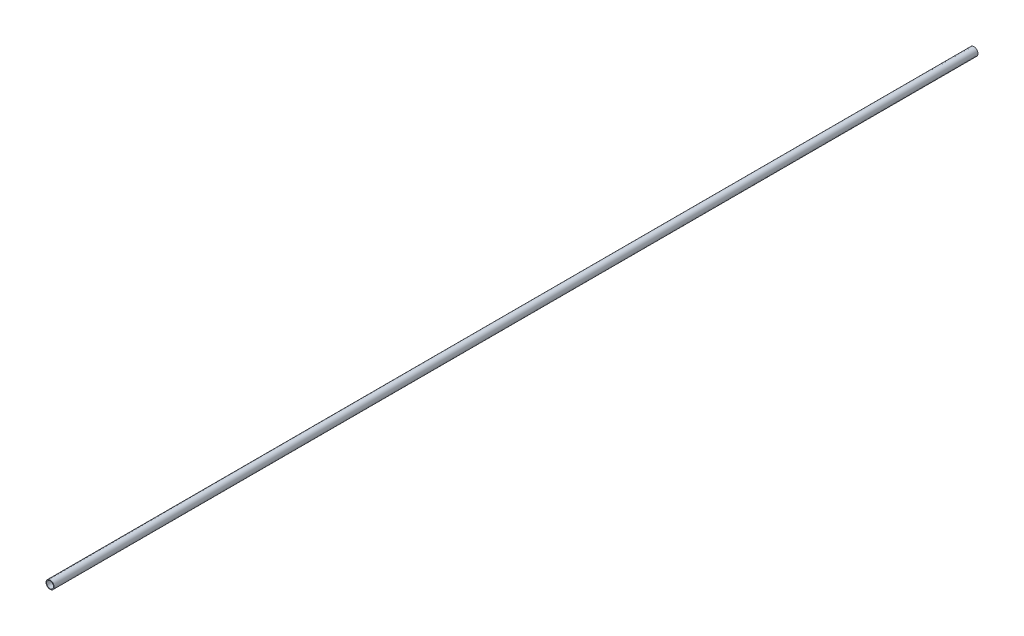
ISO-10303-21;
HEADER;
FILE_DESCRIPTION(('STEP AP214'),'2;1');
FILE_NAME('part.step','',(''),(''),'','','');
FILE_SCHEMA(('AUTOMOTIVE_DESIGN { 1 0 10303 214 1 1 1 1 }'));
ENDSEC;
DATA;
#1=APPLICATION_CONTEXT('core data for automotive mechanical design processes');
#2=APPLICATION_PROTOCOL_DEFINITION('international standard','automotive_design',2000,#1);
#3=PRODUCT_CONTEXT('',#1,'mechanical');
#4=PRODUCT('Part','Part','',(#3));
#5=PRODUCT_RELATED_PRODUCT_CATEGORY('part','',(#4));
#6=PRODUCT_DEFINITION_FORMATION('','',#4);
#7=PRODUCT_DEFINITION_CONTEXT('part definition',#1,'design');
#8=PRODUCT_DEFINITION('design','',#6,#7);
#9=PRODUCT_DEFINITION_SHAPE('','',#8);
#10=(LENGTH_UNIT() NAMED_UNIT(*) SI_UNIT(.MILLI.,.METRE.));
#11=(NAMED_UNIT(*) PLANE_ANGLE_UNIT() SI_UNIT($,.RADIAN.));
#12=(NAMED_UNIT(*) SI_UNIT($,.STERADIAN.) SOLID_ANGLE_UNIT());
#13=UNCERTAINTY_MEASURE_WITH_UNIT(LENGTH_MEASURE(1.E-05),#10,'distance_accuracy_value','');
#14=(GEOMETRIC_REPRESENTATION_CONTEXT(3) GLOBAL_UNCERTAINTY_ASSIGNED_CONTEXT((#13)) GLOBAL_UNIT_ASSIGNED_CONTEXT((#10,
#11,#12)) REPRESENTATION_CONTEXT('',''));
#15=CARTESIAN_POINT('',(0.,0.,0.));
#16=DIRECTION('',(0.,0.,1.));
#17=DIRECTION('',(1.,0.,0.));
#18=AXIS2_PLACEMENT_3D('',#15,#16,#17);
#19=CARTESIAN_POINT('',(0.,0.,5486.4));
#20=DIRECTION('',(0.,0.,1.));
#21=DIRECTION('',(1.,0.,0.));
#22=AXIS2_PLACEMENT_3D('',#19,#20,#21);
#23=PLANE('',#22);
#24=CARTESIAN_POINT('',(0.,0.,5486.4));
#25=DIRECTION('',(0.,0.,1.));
#26=DIRECTION('',(1.,0.,0.));
#27=AXIS2_PLACEMENT_3D('',#24,#25,#26);
#28=CIRCLE('',#27,24.13);
#29=CARTESIAN_POINT('',(24.13,0.,5486.4));
#30=VERTEX_POINT('',#29);
#31=EDGE_CURVE('E10',#30,#30,#28,.T.);
#32=ORIENTED_EDGE('',*,*,#31,.T.);
#33=EDGE_LOOP('',(#32));
#34=FACE_BOUND('',#33,.T.);
#35=CARTESIAN_POINT('',(0.,0.,5486.4));
#36=DIRECTION('',(0.,0.,1.));
#37=DIRECTION('',(1.,0.,0.));
#38=AXIS2_PLACEMENT_3D('',#35,#36,#37);
#39=CIRCLE('',#38,20.447);
#40=CARTESIAN_POINT('',(20.447,0.,5486.4));
#41=VERTEX_POINT('',#40);
#42=EDGE_CURVE('E47',#41,#41,#39,.T.);
#43=ORIENTED_EDGE('',*,*,#42,.F.);
#44=EDGE_LOOP('',(#43));
#45=FACE_BOUND('',#44,.T.);
#46=ADVANCED_FACE('F36',(#34,#45),#23,.T.);
#47=CARTESIAN_POINT('',(0.,0.,0.));
#48=DIRECTION('',(0.,0.,1.));
#49=DIRECTION('',(1.,0.,0.));
#50=AXIS2_PLACEMENT_3D('',#47,#48,#49);
#51=PLANE('',#50);
#52=CARTESIAN_POINT('',(0.,0.,0.));
#53=DIRECTION('',(0.,0.,1.));
#54=DIRECTION('',(1.,0.,0.));
#55=AXIS2_PLACEMENT_3D('',#52,#53,#54);
#56=CIRCLE('',#55,24.13);
#57=CARTESIAN_POINT('',(24.13,0.,0.));
#58=VERTEX_POINT('',#57);
#59=EDGE_CURVE('E40',#58,#58,#56,.T.);
#60=ORIENTED_EDGE('',*,*,#59,.F.);
#61=EDGE_LOOP('',(#60));
#62=FACE_BOUND('',#61,.T.);
#63=CARTESIAN_POINT('',(0.,0.,0.));
#64=DIRECTION('',(0.,0.,1.));
#65=DIRECTION('',(1.,0.,0.));
#66=AXIS2_PLACEMENT_3D('',#63,#64,#65);
#67=CIRCLE('',#66,20.447);
#68=CARTESIAN_POINT('',(20.447,0.,0.));
#69=VERTEX_POINT('',#68);
#70=EDGE_CURVE('E49',#69,#69,#67,.T.);
#71=ORIENTED_EDGE('',*,*,#70,.T.);
#72=EDGE_LOOP('',(#71));
#73=FACE_BOUND('',#72,.T.);
#74=ADVANCED_FACE('F59',(#62,#73),#51,.F.);
#75=CARTESIAN_POINT('',(0.,0.,5486.4));
#76=DIRECTION('',(0.,0.,-1.));
#77=DIRECTION('',(-1.,0.,0.));
#78=AXIS2_PLACEMENT_3D('',#75,#76,#77);
#79=CYLINDRICAL_SURFACE('',#78,24.13);
#80=ORIENTED_EDGE('',*,*,#31,.F.);
#81=EDGE_LOOP('',(#80));
#82=FACE_BOUND('',#81,.T.);
#83=ORIENTED_EDGE('',*,*,#59,.T.);
#84=EDGE_LOOP('',(#83));
#85=FACE_BOUND('',#84,.T.);
#86=ADVANCED_FACE('F38',(#82,#85),#79,.T.);
#87=CARTESIAN_POINT('',(0.,0.,5486.4));
#88=DIRECTION('',(0.,0.,-1.));
#89=DIRECTION('',(-1.,0.,0.));
#90=AXIS2_PLACEMENT_3D('',#87,#88,#89);
#91=CYLINDRICAL_SURFACE('',#90,20.447);
#92=ORIENTED_EDGE('',*,*,#42,.T.);
#93=EDGE_LOOP('',(#92));
#94=FACE_BOUND('',#93,.T.);
#95=ORIENTED_EDGE('',*,*,#70,.F.);
#96=EDGE_LOOP('',(#95));
#97=FACE_BOUND('',#96,.T.);
#98=ADVANCED_FACE('F55',(#94,#97),#91,.F.);
#99=CLOSED_SHELL('',(#46,#74,#86,#98));
#100=MANIFOLD_SOLID_BREP('B2',#99);
#101=ADVANCED_BREP_SHAPE_REPRESENTATION('',(#18,#100),#14);
#102=SHAPE_DEFINITION_REPRESENTATION(#9,#101);
ENDSEC;
END-ISO-10303-21;
